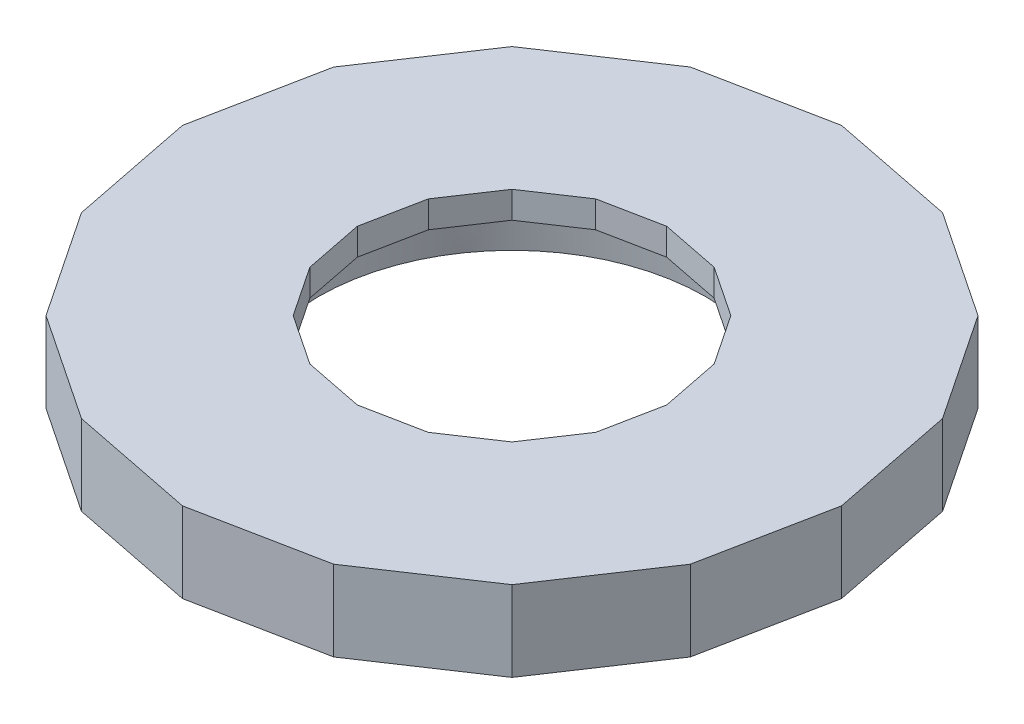
ISO-10303-21;
HEADER;
FILE_DESCRIPTION(('STEP AP214'),'2;1');
FILE_NAME('part.step','',(''),(''),'','','');
FILE_SCHEMA(('AUTOMOTIVE_DESIGN { 1 0 10303 214 1 1 1 1 }'));
ENDSEC;
DATA;
#1=APPLICATION_CONTEXT('core data for automotive mechanical design processes');
#2=APPLICATION_PROTOCOL_DEFINITION('international standard','automotive_design',2000,#1);
#3=PRODUCT_CONTEXT('',#1,'mechanical');
#4=PRODUCT('Part','Part','',(#3));
#5=PRODUCT_RELATED_PRODUCT_CATEGORY('part','',(#4));
#6=PRODUCT_DEFINITION_FORMATION('','',#4);
#7=PRODUCT_DEFINITION_CONTEXT('part definition',#1,'design');
#8=PRODUCT_DEFINITION('design','',#6,#7);
#9=PRODUCT_DEFINITION_SHAPE('','',#8);
#10=(LENGTH_UNIT() NAMED_UNIT(*) SI_UNIT(.MILLI.,.METRE.));
#11=(NAMED_UNIT(*) PLANE_ANGLE_UNIT() SI_UNIT($,.RADIAN.));
#12=(NAMED_UNIT(*) SI_UNIT($,.STERADIAN.) SOLID_ANGLE_UNIT());
#13=UNCERTAINTY_MEASURE_WITH_UNIT(LENGTH_MEASURE(1.E-05),#10,'distance_accuracy_value','');
#14=(GEOMETRIC_REPRESENTATION_CONTEXT(3) GLOBAL_UNCERTAINTY_ASSIGNED_CONTEXT((#13)) GLOBAL_UNIT_ASSIGNED_CONTEXT((#10,
#11,#12)) REPRESENTATION_CONTEXT('',''));
#15=CARTESIAN_POINT('',(0.,0.,0.));
#16=DIRECTION('',(0.,0.,1.));
#17=DIRECTION('',(1.,0.,0.));
#18=AXIS2_PLACEMENT_3D('',#15,#16,#17);
#19=CARTESIAN_POINT('',(0.,0.,0.));
#20=DIRECTION('',(0.,1.,0.));
#21=DIRECTION('',(0.,0.,1.));
#22=AXIS2_PLACEMENT_3D('',#19,#20,#21);
#23=PLANE('',#22);
#24=DIRECTION('',(-0.195090322016129,0.,0.98078528040323));
#25=VECTOR('',#24,1.);
#26=CARTESIAN_POINT('',(-72.1713098321094,0.,-29.8943353466905));
#27=LINE('',#26,#25);
#28=CARTESIAN_POINT('',(-72.1713098321094,0.,-29.8943353466905));
#29=VERTEX_POINT('',#28);
#30=CARTESIAN_POINT('',(-78.117662847161,0.,0.));
#31=VERTEX_POINT('',#30);
#32=EDGE_CURVE('E305',#29,#31,#27,.T.);
#33=ORIENTED_EDGE('',*,*,#32,.F.);
#34=DIRECTION('',(-0.555570233019603,0.,0.831469612302545));
#35=VECTOR('',#34,1.);
#36=CARTESIAN_POINT('',(-55.2375291296719,0.,-55.237529129672));
#37=LINE('',#36,#35);
#38=CARTESIAN_POINT('',(-55.2375291296719,0.,-55.237529129672));
#39=VERTEX_POINT('',#38);
#40=EDGE_CURVE('E310',#39,#29,#37,.T.);
#41=ORIENTED_EDGE('',*,*,#40,.F.);
#42=DIRECTION('',(-0.831469612302546,0.,0.555570233019601));
#43=VECTOR('',#42,1.);
#44=CARTESIAN_POINT('',(-29.8943353466904,0.,-72.1713098321094));
#45=LINE('',#44,#43);
#46=CARTESIAN_POINT('',(-29.8943353466904,0.,-72.1713098321094));
#47=VERTEX_POINT('',#46);
#48=EDGE_CURVE('E375',#47,#39,#45,.T.);
#49=ORIENTED_EDGE('',*,*,#48,.F.);
#50=DIRECTION('',(-0.980785280403231,0.,0.195090322016127));
#51=VECTOR('',#50,1.);
#52=CARTESIAN_POINT('',(0.,0.,-78.1176628471609));
#53=LINE('',#52,#51);
#54=CARTESIAN_POINT('',(0.,0.,-78.1176628471609));
#55=VERTEX_POINT('',#54);
#56=EDGE_CURVE('E373',#55,#47,#53,.T.);
#57=ORIENTED_EDGE('',*,*,#56,.F.);
#58=DIRECTION('',(-0.98078528040323,0.,-0.195090322016128));
#59=VECTOR('',#58,1.);
#60=CARTESIAN_POINT('',(29.8943353466906,0.,-72.1713098321093));
#61=LINE('',#60,#59);
#62=CARTESIAN_POINT('',(29.8943353466906,0.,-72.1713098321093));
#63=VERTEX_POINT('',#62);
#64=EDGE_CURVE('E371',#63,#55,#61,.T.);
#65=ORIENTED_EDGE('',*,*,#64,.F.);
#66=DIRECTION('',(-0.831469612302545,0.,-0.555570233019603));
#67=VECTOR('',#66,1.);
#68=CARTESIAN_POINT('',(55.237529129672,0.,-55.2375291296719));
#69=LINE('',#68,#67);
#70=CARTESIAN_POINT('',(55.237529129672,0.,-55.2375291296719));
#71=VERTEX_POINT('',#70);
#72=EDGE_CURVE('E369',#71,#63,#69,.T.);
#73=ORIENTED_EDGE('',*,*,#72,.F.);
#74=DIRECTION('',(-0.555570233019601,0.,-0.831469612302546));
#75=VECTOR('',#74,1.);
#76=CARTESIAN_POINT('',(72.1713098321094,0.,-29.8943353466904));
#77=LINE('',#76,#75);
#78=CARTESIAN_POINT('',(72.1713098321094,0.,-29.8943353466904));
#79=VERTEX_POINT('',#78);
#80=EDGE_CURVE('E367',#79,#71,#77,.T.);
#81=ORIENTED_EDGE('',*,*,#80,.F.);
#82=DIRECTION('',(-0.195090322016128,0.,-0.980785280403231));
#83=VECTOR('',#82,1.);
#84=CARTESIAN_POINT('',(78.117662847161,0.,0.));
#85=LINE('',#84,#83);
#86=CARTESIAN_POINT('',(78.117662847161,0.,0.));
#87=VERTEX_POINT('',#86);
#88=EDGE_CURVE('E365',#87,#79,#85,.T.);
#89=ORIENTED_EDGE('',*,*,#88,.F.);
#90=DIRECTION('',(0.195090322016129,0.,-0.98078528040323));
#91=VECTOR('',#90,1.);
#92=CARTESIAN_POINT('',(72.1713098321094,0.,29.8943353466904));
#93=LINE('',#92,#91);
#94=CARTESIAN_POINT('',(72.1713098321094,0.,29.8943353466904));
#95=VERTEX_POINT('',#94);
#96=EDGE_CURVE('E363',#95,#87,#93,.T.);
#97=ORIENTED_EDGE('',*,*,#96,.F.);
#98=DIRECTION('',(0.555570233019603,0.,-0.831469612302545));
#99=VECTOR('',#98,1.);
#100=CARTESIAN_POINT('',(55.2375291296719,0.,55.237529129672));
#101=LINE('',#100,#99);
#102=CARTESIAN_POINT('',(55.2375291296719,0.,55.237529129672));
#103=VERTEX_POINT('',#102);
#104=EDGE_CURVE('E361',#103,#95,#101,.T.);
#105=ORIENTED_EDGE('',*,*,#104,.F.);
#106=DIRECTION('',(0.831469612302546,0.,-0.555570233019601));
#107=VECTOR('',#106,1.);
#108=CARTESIAN_POINT('',(29.8943353466904,0.,72.1713098321094));
#109=LINE('',#108,#107);
#110=CARTESIAN_POINT('',(29.8943353466904,0.,72.1713098321094));
#111=VERTEX_POINT('',#110);
#112=EDGE_CURVE('E359',#111,#103,#109,.T.);
#113=ORIENTED_EDGE('',*,*,#112,.F.);
#114=DIRECTION('',(0.980785280403231,0.,-0.195090322016127));
#115=VECTOR('',#114,1.);
#116=CARTESIAN_POINT('',(0.,0.,78.117662847161));
#117=LINE('',#116,#115);
#118=CARTESIAN_POINT('',(0.,0.,78.117662847161));
#119=VERTEX_POINT('',#118);
#120=EDGE_CURVE('E356',#119,#111,#117,.T.);
#121=ORIENTED_EDGE('',*,*,#120,.F.);
#122=DIRECTION('',(0.98078528040323,0.,0.195090322016128));
#123=VECTOR('',#122,1.);
#124=CARTESIAN_POINT('',(-29.8943353466905,0.,72.1713098321094));
#125=LINE('',#124,#123);
#126=CARTESIAN_POINT('',(-29.8943353466905,0.,72.1713098321094));
#127=VERTEX_POINT('',#126);
#128=EDGE_CURVE('E354',#127,#119,#125,.T.);
#129=ORIENTED_EDGE('',*,*,#128,.F.);
#130=DIRECTION('',(0.831469612302545,0.,0.555570233019603));
#131=VECTOR('',#130,1.);
#132=CARTESIAN_POINT('',(-55.237529129672,0.,55.2375291296719));
#133=LINE('',#132,#131);
#134=CARTESIAN_POINT('',(-55.237529129672,0.,55.2375291296719));
#135=VERTEX_POINT('',#134);
#136=EDGE_CURVE('E352',#135,#127,#133,.T.);
#137=ORIENTED_EDGE('',*,*,#136,.F.);
#138=DIRECTION('',(0.555570233019601,0.,0.831469612302546));
#139=VECTOR('',#138,1.);
#140=CARTESIAN_POINT('',(-72.1713098321094,0.,29.8943353466904));
#141=LINE('',#140,#139);
#142=CARTESIAN_POINT('',(-72.1713098321094,0.,29.8943353466904));
#143=VERTEX_POINT('',#142);
#144=EDGE_CURVE('E350',#143,#135,#141,.T.);
#145=ORIENTED_EDGE('',*,*,#144,.F.);
#146=DIRECTION('',(0.195090322016127,0.,0.980785280403231));
#147=VECTOR('',#146,1.);
#148=CARTESIAN_POINT('',(-78.117662847161,0.,0.));
#149=LINE('',#148,#147);
#150=EDGE_CURVE('E347',#31,#143,#149,.T.);
#151=ORIENTED_EDGE('',*,*,#150,.F.);
#152=EDGE_LOOP('',(#33,#41,#49,#57,#65,#73,#81,#89,#97,#105,#113,#121,#129,#137,#145,#151));
#153=FACE_BOUND('',#152,.T.);
#154=CARTESIAN_POINT('',(0.,0.,0.));
#155=DIRECTION('',(0.,-1.,0.));
#156=DIRECTION('',(1.,0.,0.));
#157=AXIS2_PLACEMENT_3D('',#154,#155,#156);
#158=CIRCLE('',#157,45.8942882882378);
#159=CARTESIAN_POINT('',(45.8942882882378,-1.33734634006263E-13,0.));
#160=VERTEX_POINT('',#159);
#161=EDGE_CURVE('E764',#160,#160,#158,.T.);
#162=ORIENTED_EDGE('',*,*,#161,.F.);
#163=EDGE_LOOP('',(#162));
#164=FACE_BOUND('',#163,.T.);
#165=ADVANCED_FACE('F34',(#153,#164),#23,.F.);
#166=CARTESIAN_POINT('',(-33.8892669105209,19.05,-14.0373939732195));
#167=DIRECTION('',(0.98078528040323,0.,0.195090322016129));
#168=DIRECTION('',(0.195090322016129,0.,-0.98078528040323));
#169=AXIS2_PLACEMENT_3D('',#166,#167,#168);
#170=PLANE('',#169);
#171=DIRECTION('',(0.,-1.,0.));
#172=VECTOR('',#171,1.);
#173=CARTESIAN_POINT('',(-36.6814781775749,19.05,0.));
#174=LINE('',#173,#172);
#175=CARTESIAN_POINT('',(-36.6814781775749,19.05,0.));
#176=VERTEX_POINT('',#175);
#177=CARTESIAN_POINT('',(-36.6814781775749,12.7,0.));
#178=VERTEX_POINT('',#177);
#179=EDGE_CURVE('E252',#176,#178,#174,.T.);
#180=ORIENTED_EDGE('',*,*,#179,.T.);
#181=DIRECTION('',(0.195090322016129,0.,-0.98078528040323));
#182=VECTOR('',#181,1.);
#183=CARTESIAN_POINT('',(-33.8892669105209,12.7,-14.0373939732195));
#184=LINE('',#183,#182);
#185=CARTESIAN_POINT('',(-33.8892669105209,12.7,-14.0373939732195));
#186=VERTEX_POINT('',#185);
#187=EDGE_CURVE('E242',#178,#186,#184,.T.);
#188=ORIENTED_EDGE('',*,*,#187,.T.);
#189=DIRECTION('',(0.,-1.,0.));
#190=VECTOR('',#189,1.);
#191=CARTESIAN_POINT('',(-33.8892669105209,19.05,-14.0373939732195));
#192=LINE('',#191,#190);
#193=CARTESIAN_POINT('',(-33.8892669105209,19.05,-14.0373939732195));
#194=VERTEX_POINT('',#193);
#195=EDGE_CURVE('E249',#194,#186,#192,.T.);
#196=ORIENTED_EDGE('',*,*,#195,.F.);
#197=DIRECTION('',(-0.195090322016129,0.,0.98078528040323));
#198=VECTOR('',#197,1.);
#199=CARTESIAN_POINT('',(-33.8892669105209,19.05,-14.0373939732195));
#200=LINE('',#199,#198);
#201=EDGE_CURVE('E253',#194,#176,#200,.T.);
#202=ORIENTED_EDGE('',*,*,#201,.T.);
#203=EDGE_LOOP('',(#180,#188,#196,#202));
#204=FACE_BOUND('',#203,.T.);
#205=ADVANCED_FACE('F248',(#204),#170,.T.);
#206=CARTESIAN_POINT('',(-36.6814781775749,19.05,0.));
#207=DIRECTION('',(0.98078528040323,0.,-0.195090322016128));
#208=DIRECTION('',(-0.195090322016128,0.,-0.980785280403231));
#209=AXIS2_PLACEMENT_3D('',#206,#207,#208);
#210=PLANE('',#209);
#211=DIRECTION('',(0.,-1.,0.));
#212=VECTOR('',#211,1.);
#213=CARTESIAN_POINT('',(-33.8892669105209,19.05,14.0373939732195));
#214=LINE('',#213,#212);
#215=CARTESIAN_POINT('',(-33.8892669105209,19.05,14.0373939732195));
#216=VERTEX_POINT('',#215);
#217=CARTESIAN_POINT('',(-33.8892669105209,12.7,14.0373939732195));
#218=VERTEX_POINT('',#217);
#219=EDGE_CURVE('E301',#216,#218,#214,.T.);
#220=ORIENTED_EDGE('',*,*,#219,.T.);
#221=DIRECTION('',(-0.195090322016128,0.,-0.980785280403231));
#222=VECTOR('',#221,1.);
#223=CARTESIAN_POINT('',(-36.6814781775749,12.7,0.));
#224=LINE('',#223,#222);
#225=EDGE_CURVE('E254',#218,#178,#224,.T.);
#226=ORIENTED_EDGE('',*,*,#225,.T.);
#227=ORIENTED_EDGE('',*,*,#179,.F.);
#228=DIRECTION('',(0.195090322016128,0.,0.980785280403231));
#229=VECTOR('',#228,1.);
#230=CARTESIAN_POINT('',(-36.6814781775749,19.05,0.));
#231=LINE('',#230,#229);
#232=EDGE_CURVE('E810',#176,#216,#231,.T.);
#233=ORIENTED_EDGE('',*,*,#232,.T.);
#234=EDGE_LOOP('',(#220,#226,#227,#233));
#235=FACE_BOUND('',#234,.T.);
#236=ADVANCED_FACE('F520',(#235),#210,.T.);
#237=CARTESIAN_POINT('',(-33.8892669105209,19.05,14.0373939732195));
#238=DIRECTION('',(0.831469612302545,0.,-0.555570233019602));
#239=DIRECTION('',(-0.555570233019602,0.,-0.831469612302546));
#240=AXIS2_PLACEMENT_3D('',#237,#238,#239);
#241=PLANE('',#240);
#242=DIRECTION('',(0.,-1.,0.));
#243=VECTOR('',#242,1.);
#244=CARTESIAN_POINT('',(-25.9377219633096,19.05,25.9377219633095));
#245=LINE('',#244,#243);
#246=CARTESIAN_POINT('',(-25.9377219633096,19.05,25.9377219633095));
#247=VERTEX_POINT('',#246);
#248=CARTESIAN_POINT('',(-25.9377219633096,12.7,25.9377219633095));
#249=VERTEX_POINT('',#248);
#250=EDGE_CURVE('E298',#247,#249,#245,.T.);
#251=ORIENTED_EDGE('',*,*,#250,.T.);
#252=DIRECTION('',(-0.555570233019602,0.,-0.831469612302546));
#253=VECTOR('',#252,1.);
#254=CARTESIAN_POINT('',(-33.8892669105209,12.7,14.0373939732195));
#255=LINE('',#254,#253);
#256=EDGE_CURVE('E805',#249,#218,#255,.T.);
#257=ORIENTED_EDGE('',*,*,#256,.T.);
#258=ORIENTED_EDGE('',*,*,#219,.F.);
#259=DIRECTION('',(0.555570233019602,0.,0.831469612302545));
#260=VECTOR('',#259,1.);
#261=CARTESIAN_POINT('',(-33.8892669105209,19.05,14.0373939732195));
#262=LINE('',#261,#260);
#263=EDGE_CURVE('E812',#216,#247,#262,.T.);
#264=ORIENTED_EDGE('',*,*,#263,.T.);
#265=EDGE_LOOP('',(#251,#257,#258,#264));
#266=FACE_BOUND('',#265,.T.);
#267=ADVANCED_FACE('F696',(#266),#241,.T.);
#268=CARTESIAN_POINT('',(-25.9377219633096,19.05,25.9377219633095));
#269=DIRECTION('',(0.555570233019603,0.,-0.831469612302545));
#270=DIRECTION('',(-0.831469612302545,0.,-0.555570233019603));
#271=AXIS2_PLACEMENT_3D('',#268,#269,#270);
#272=PLANE('',#271);
#273=DIRECTION('',(0.,-1.,0.));
#274=VECTOR('',#273,1.);
#275=CARTESIAN_POINT('',(-14.0373939732195,19.05,33.8892669105208));
#276=LINE('',#275,#274);
#277=CARTESIAN_POINT('',(-14.0373939732195,19.05,33.8892669105208));
#278=VERTEX_POINT('',#277);
#279=CARTESIAN_POINT('',(-14.0373939732195,12.7,33.8892669105208));
#280=VERTEX_POINT('',#279);
#281=EDGE_CURVE('E295',#278,#280,#276,.T.);
#282=ORIENTED_EDGE('',*,*,#281,.T.);
#283=DIRECTION('',(-0.831469612302545,0.,-0.555570233019603));
#284=VECTOR('',#283,1.);
#285=CARTESIAN_POINT('',(-25.9377219633096,12.7,25.9377219633095));
#286=LINE('',#285,#284);
#287=EDGE_CURVE('E802',#280,#249,#286,.T.);
#288=ORIENTED_EDGE('',*,*,#287,.T.);
#289=ORIENTED_EDGE('',*,*,#250,.F.);
#290=DIRECTION('',(0.831469612302545,0.,0.555570233019603));
#291=VECTOR('',#290,1.);
#292=CARTESIAN_POINT('',(-25.9377219633096,19.05,25.9377219633095));
#293=LINE('',#292,#291);
#294=EDGE_CURVE('E814',#247,#278,#293,.T.);
#295=ORIENTED_EDGE('',*,*,#294,.T.);
#296=EDGE_LOOP('',(#282,#288,#289,#295));
#297=FACE_BOUND('',#296,.T.);
#298=ADVANCED_FACE('F687',(#297),#272,.T.);
#299=CARTESIAN_POINT('',(-14.0373939732195,19.05,33.8892669105208));
#300=DIRECTION('',(0.195090322016128,0.,-0.980785280403231));
#301=DIRECTION('',(-0.98078528040323,0.,-0.195090322016128));
#302=AXIS2_PLACEMENT_3D('',#299,#300,#301);
#303=PLANE('',#302);
#304=DIRECTION('',(0.,-1.,0.));
#305=VECTOR('',#304,1.);
#306=CARTESIAN_POINT('',(0.,19.05,36.6814781775749));
#307=LINE('',#306,#305);
#308=CARTESIAN_POINT('',(0.,19.05,36.6814781775749));
#309=VERTEX_POINT('',#308);
#310=CARTESIAN_POINT('',(0.,12.7,36.6814781775749));
#311=VERTEX_POINT('',#310);
#312=EDGE_CURVE('E292',#309,#311,#307,.T.);
#313=ORIENTED_EDGE('',*,*,#312,.T.);
#314=DIRECTION('',(-0.98078528040323,0.,-0.195090322016128));
#315=VECTOR('',#314,1.);
#316=CARTESIAN_POINT('',(-14.0373939732195,12.7,33.8892669105208));
#317=LINE('',#316,#315);
#318=EDGE_CURVE('E799',#311,#280,#317,.T.);
#319=ORIENTED_EDGE('',*,*,#318,.T.);
#320=ORIENTED_EDGE('',*,*,#281,.F.);
#321=DIRECTION('',(0.98078528040323,0.,0.195090322016128));
#322=VECTOR('',#321,1.);
#323=CARTESIAN_POINT('',(-14.0373939732195,19.05,33.8892669105208));
#324=LINE('',#323,#322);
#325=EDGE_CURVE('E816',#278,#309,#324,.T.);
#326=ORIENTED_EDGE('',*,*,#325,.T.);
#327=EDGE_LOOP('',(#313,#319,#320,#326));
#328=FACE_BOUND('',#327,.T.);
#329=ADVANCED_FACE('F678',(#328),#303,.T.);
#330=CARTESIAN_POINT('',(0.,19.05,36.6814781775749));
#331=DIRECTION('',(-0.195090322016128,0.,-0.980785280403231));
#332=DIRECTION('',(-0.980785280403231,0.,0.195090322016128));
#333=AXIS2_PLACEMENT_3D('',#330,#331,#332);
#334=PLANE('',#333);
#335=DIRECTION('',(0.,-1.,0.));
#336=VECTOR('',#335,1.);
#337=CARTESIAN_POINT('',(14.0373939732195,19.05,33.8892669105209));
#338=LINE('',#337,#336);
#339=CARTESIAN_POINT('',(14.0373939732195,19.05,33.8892669105209));
#340=VERTEX_POINT('',#339);
#341=CARTESIAN_POINT('',(14.0373939732195,12.6999999999999,33.8892669105209));
#342=VERTEX_POINT('',#341);
#343=EDGE_CURVE('E289',#340,#342,#338,.T.);
#344=ORIENTED_EDGE('',*,*,#343,.T.);
#345=DIRECTION('',(-0.980785280403231,0.,0.195090322016128));
#346=VECTOR('',#345,1.);
#347=CARTESIAN_POINT('',(0.,12.7,36.6814781775749));
#348=LINE('',#347,#346);
#349=EDGE_CURVE('E796',#342,#311,#348,.T.);
#350=ORIENTED_EDGE('',*,*,#349,.T.);
#351=ORIENTED_EDGE('',*,*,#312,.F.);
#352=DIRECTION('',(0.980785280403231,0.,-0.195090322016128));
#353=VECTOR('',#352,1.);
#354=CARTESIAN_POINT('',(0.,19.05,36.6814781775749));
#355=LINE('',#354,#353);
#356=EDGE_CURVE('E819',#309,#340,#355,.T.);
#357=ORIENTED_EDGE('',*,*,#356,.T.);
#358=EDGE_LOOP('',(#344,#350,#351,#357));
#359=FACE_BOUND('',#358,.T.);
#360=ADVANCED_FACE('F669',(#359),#334,.T.);
#361=CARTESIAN_POINT('',(14.0373939732195,19.05,33.8892669105209));
#362=DIRECTION('',(-0.555570233019602,0.,-0.831469612302545));
#363=DIRECTION('',(-0.831469612302545,0.,0.555570233019602));
#364=AXIS2_PLACEMENT_3D('',#361,#362,#363);
#365=PLANE('',#364);
#366=DIRECTION('',(0.,-1.,0.));
#367=VECTOR('',#366,1.);
#368=CARTESIAN_POINT('',(25.9377219633096,19.05,25.9377219633096));
#369=LINE('',#368,#367);
#370=CARTESIAN_POINT('',(25.9377219633096,19.05,25.9377219633096));
#371=VERTEX_POINT('',#370);
#372=CARTESIAN_POINT('',(25.9377219633095,12.6999999999999,25.9377219633096));
#373=VERTEX_POINT('',#372);
#374=EDGE_CURVE('E286',#371,#373,#369,.T.);
#375=ORIENTED_EDGE('',*,*,#374,.T.);
#376=DIRECTION('',(-0.831469612302545,0.,0.555570233019602));
#377=VECTOR('',#376,1.);
#378=CARTESIAN_POINT('',(14.0373939732195,12.6999999999999,33.8892669105209));
#379=LINE('',#378,#377);
#380=EDGE_CURVE('E793',#373,#342,#379,.T.);
#381=ORIENTED_EDGE('',*,*,#380,.T.);
#382=ORIENTED_EDGE('',*,*,#343,.F.);
#383=DIRECTION('',(0.831469612302545,0.,-0.555570233019602));
#384=VECTOR('',#383,1.);
#385=CARTESIAN_POINT('',(14.0373939732195,19.05,33.8892669105209));
#386=LINE('',#385,#384);
#387=EDGE_CURVE('E821',#340,#371,#386,.T.);
#388=ORIENTED_EDGE('',*,*,#387,.T.);
#389=EDGE_LOOP('',(#375,#381,#382,#388));
#390=FACE_BOUND('',#389,.T.);
#391=ADVANCED_FACE('F660',(#390),#365,.T.);
#392=CARTESIAN_POINT('',(25.9377219633096,19.05,25.9377219633096));
#393=DIRECTION('',(-0.831469612302545,0.,-0.555570233019603));
#394=DIRECTION('',(-0.555570233019603,0.,0.831469612302545));
#395=AXIS2_PLACEMENT_3D('',#392,#393,#394);
#396=PLANE('',#395);
#397=DIRECTION('',(0.,-1.,0.));
#398=VECTOR('',#397,1.);
#399=CARTESIAN_POINT('',(33.8892669105209,19.05,14.0373939732195));
#400=LINE('',#399,#398);
#401=CARTESIAN_POINT('',(33.8892669105209,19.05,14.0373939732195));
#402=VERTEX_POINT('',#401);
#403=CARTESIAN_POINT('',(33.8892669105209,12.6999999999999,14.0373939732195));
#404=VERTEX_POINT('',#403);
#405=EDGE_CURVE('E283',#402,#404,#400,.T.);
#406=ORIENTED_EDGE('',*,*,#405,.T.);
#407=DIRECTION('',(-0.555570233019603,0.,0.831469612302545));
#408=VECTOR('',#407,1.);
#409=CARTESIAN_POINT('',(25.9377219633095,12.6999999999999,25.9377219633096));
#410=LINE('',#409,#408);
#411=EDGE_CURVE('E790',#404,#373,#410,.T.);
#412=ORIENTED_EDGE('',*,*,#411,.T.);
#413=ORIENTED_EDGE('',*,*,#374,.F.);
#414=DIRECTION('',(0.555570233019603,0.,-0.831469612302545));
#415=VECTOR('',#414,1.);
#416=CARTESIAN_POINT('',(25.9377219633096,19.05,25.9377219633096));
#417=LINE('',#416,#415);
#418=EDGE_CURVE('E823',#371,#402,#417,.T.);
#419=ORIENTED_EDGE('',*,*,#418,.T.);
#420=EDGE_LOOP('',(#406,#412,#413,#419));
#421=FACE_BOUND('',#420,.T.);
#422=ADVANCED_FACE('F651',(#421),#396,.T.);
#423=CARTESIAN_POINT('',(33.8892669105209,19.05,14.0373939732195));
#424=DIRECTION('',(-0.98078528040323,0.,-0.195090322016128));
#425=DIRECTION('',(-0.195090322016128,0.,0.98078528040323));
#426=AXIS2_PLACEMENT_3D('',#423,#424,#425);
#427=PLANE('',#426);
#428=DIRECTION('',(0.,-1.,0.));
#429=VECTOR('',#428,1.);
#430=CARTESIAN_POINT('',(36.6814781775749,19.05,0.));
#431=LINE('',#430,#429);
#432=CARTESIAN_POINT('',(36.6814781775749,19.05,0.));
#433=VERTEX_POINT('',#432);
#434=CARTESIAN_POINT('',(36.6814781775749,12.6999999999999,0.));
#435=VERTEX_POINT('',#434);
#436=EDGE_CURVE('E280',#433,#435,#431,.T.);
#437=ORIENTED_EDGE('',*,*,#436,.T.);
#438=DIRECTION('',(-0.195090322016128,0.,0.98078528040323));
#439=VECTOR('',#438,1.);
#440=CARTESIAN_POINT('',(33.8892669105209,12.6999999999999,14.0373939732195));
#441=LINE('',#440,#439);
#442=EDGE_CURVE('E787',#435,#404,#441,.T.);
#443=ORIENTED_EDGE('',*,*,#442,.T.);
#444=ORIENTED_EDGE('',*,*,#405,.F.);
#445=DIRECTION('',(0.195090322016128,0.,-0.98078528040323));
#446=VECTOR('',#445,1.);
#447=CARTESIAN_POINT('',(33.8892669105209,19.05,14.0373939732195));
#448=LINE('',#447,#446);
#449=EDGE_CURVE('E825',#402,#433,#448,.T.);
#450=ORIENTED_EDGE('',*,*,#449,.T.);
#451=EDGE_LOOP('',(#437,#443,#444,#450));
#452=FACE_BOUND('',#451,.T.);
#453=ADVANCED_FACE('F642',(#452),#427,.T.);
#454=CARTESIAN_POINT('',(36.6814781775749,19.05,0.));
#455=DIRECTION('',(-0.98078528040323,0.,0.195090322016128));
#456=DIRECTION('',(0.195090322016128,0.,0.980785280403231));
#457=AXIS2_PLACEMENT_3D('',#454,#455,#456);
#458=PLANE('',#457);
#459=DIRECTION('',(0.,-1.,0.));
#460=VECTOR('',#459,1.);
#461=CARTESIAN_POINT('',(33.8892669105209,19.05,-14.0373939732195));
#462=LINE('',#461,#460);
#463=CARTESIAN_POINT('',(33.8892669105209,19.05,-14.0373939732195));
#464=VERTEX_POINT('',#463);
#465=CARTESIAN_POINT('',(33.8892669105209,12.6999999999999,-14.0373939732195));
#466=VERTEX_POINT('',#465);
#467=EDGE_CURVE('E277',#464,#466,#462,.T.);
#468=ORIENTED_EDGE('',*,*,#467,.T.);
#469=DIRECTION('',(0.195090322016128,0.,0.980785280403231));
#470=VECTOR('',#469,1.);
#471=CARTESIAN_POINT('',(36.6814781775749,12.6999999999999,0.));
#472=LINE('',#471,#470);
#473=EDGE_CURVE('E784',#466,#435,#472,.T.);
#474=ORIENTED_EDGE('',*,*,#473,.T.);
#475=ORIENTED_EDGE('',*,*,#436,.F.);
#476=DIRECTION('',(-0.195090322016128,0.,-0.980785280403231));
#477=VECTOR('',#476,1.);
#478=CARTESIAN_POINT('',(36.6814781775749,19.05,0.));
#479=LINE('',#478,#477);
#480=EDGE_CURVE('E827',#433,#464,#479,.T.);
#481=ORIENTED_EDGE('',*,*,#480,.T.);
#482=EDGE_LOOP('',(#468,#474,#475,#481));
#483=FACE_BOUND('',#482,.T.);
#484=ADVANCED_FACE('F633',(#483),#458,.T.);
#485=CARTESIAN_POINT('',(33.8892669105209,19.05,-14.0373939732195));
#486=DIRECTION('',(-0.831469612302545,0.,0.555570233019602));
#487=DIRECTION('',(0.555570233019602,0.,0.831469612302545));
#488=AXIS2_PLACEMENT_3D('',#485,#486,#487);
#489=PLANE('',#488);
#490=DIRECTION('',(0.,-1.,0.));
#491=VECTOR('',#490,1.);
#492=CARTESIAN_POINT('',(25.9377219633096,19.05,-25.9377219633096));
#493=LINE('',#492,#491);
#494=CARTESIAN_POINT('',(25.9377219633096,19.05,-25.9377219633096));
#495=VERTEX_POINT('',#494);
#496=CARTESIAN_POINT('',(25.9377219633096,12.6999999999999,-25.9377219633095));
#497=VERTEX_POINT('',#496);
#498=EDGE_CURVE('E274',#495,#497,#493,.T.);
#499=ORIENTED_EDGE('',*,*,#498,.T.);
#500=DIRECTION('',(0.555570233019602,0.,0.831469612302545));
#501=VECTOR('',#500,1.);
#502=CARTESIAN_POINT('',(33.8892669105209,12.6999999999999,-14.0373939732195));
#503=LINE('',#502,#501);
#504=EDGE_CURVE('E781',#497,#466,#503,.T.);
#505=ORIENTED_EDGE('',*,*,#504,.T.);
#506=ORIENTED_EDGE('',*,*,#467,.F.);
#507=DIRECTION('',(-0.555570233019602,0.,-0.831469612302545));
#508=VECTOR('',#507,1.);
#509=CARTESIAN_POINT('',(33.8892669105209,19.05,-14.0373939732195));
#510=LINE('',#509,#508);
#511=EDGE_CURVE('E829',#464,#495,#510,.T.);
#512=ORIENTED_EDGE('',*,*,#511,.T.);
#513=EDGE_LOOP('',(#499,#505,#506,#512));
#514=FACE_BOUND('',#513,.T.);
#515=ADVANCED_FACE('F624',(#514),#489,.T.);
#516=CARTESIAN_POINT('',(25.9377219633096,19.05,-25.9377219633096));
#517=DIRECTION('',(-0.555570233019603,0.,0.831469612302545));
#518=DIRECTION('',(0.831469612302545,0.,0.555570233019603));
#519=AXIS2_PLACEMENT_3D('',#516,#517,#518);
#520=PLANE('',#519);
#521=DIRECTION('',(0.,-1.,0.));
#522=VECTOR('',#521,1.);
#523=CARTESIAN_POINT('',(14.0373939732195,19.05,-33.8892669105208));
#524=LINE('',#523,#522);
#525=CARTESIAN_POINT('',(14.0373939732195,19.05,-33.8892669105208));
#526=VERTEX_POINT('',#525);
#527=CARTESIAN_POINT('',(14.0373939732195,12.6999999999999,-33.8892669105208));
#528=VERTEX_POINT('',#527);
#529=EDGE_CURVE('E271',#526,#528,#524,.T.);
#530=ORIENTED_EDGE('',*,*,#529,.T.);
#531=DIRECTION('',(0.831469612302545,0.,0.555570233019603));
#532=VECTOR('',#531,1.);
#533=CARTESIAN_POINT('',(25.9377219633096,12.6999999999999,-25.9377219633096));
#534=LINE('',#533,#532);
#535=EDGE_CURVE('E778',#528,#497,#534,.T.);
#536=ORIENTED_EDGE('',*,*,#535,.T.);
#537=ORIENTED_EDGE('',*,*,#498,.F.);
#538=DIRECTION('',(-0.831469612302545,0.,-0.555570233019602));
#539=VECTOR('',#538,1.);
#540=CARTESIAN_POINT('',(25.9377219633096,19.05,-25.9377219633096));
#541=LINE('',#540,#539);
#542=EDGE_CURVE('E831',#495,#526,#541,.T.);
#543=ORIENTED_EDGE('',*,*,#542,.T.);
#544=EDGE_LOOP('',(#530,#536,#537,#543));
#545=FACE_BOUND('',#544,.T.);
#546=ADVANCED_FACE('F615',(#545),#520,.T.);
#547=CARTESIAN_POINT('',(14.0373939732195,19.05,-33.8892669105208));
#548=DIRECTION('',(-0.195090322016129,0.,0.98078528040323));
#549=DIRECTION('',(0.980785280403231,0.,0.195090322016129));
#550=AXIS2_PLACEMENT_3D('',#547,#548,#549);
#551=PLANE('',#550);
#552=DIRECTION('',(0.,-1.,0.));
#553=VECTOR('',#552,1.);
#554=CARTESIAN_POINT('',(0.,19.05,-36.6814781775749));
#555=LINE('',#554,#553);
#556=CARTESIAN_POINT('',(0.,19.05,-36.6814781775749));
#557=VERTEX_POINT('',#556);
#558=CARTESIAN_POINT('',(0.,12.7,-36.6814781775749));
#559=VERTEX_POINT('',#558);
#560=EDGE_CURVE('E268',#557,#559,#555,.T.);
#561=ORIENTED_EDGE('',*,*,#560,.T.);
#562=DIRECTION('',(0.980785280403231,0.,0.195090322016129));
#563=VECTOR('',#562,1.);
#564=CARTESIAN_POINT('',(14.0373939732195,12.6999999999999,-33.8892669105208));
#565=LINE('',#564,#563);
#566=EDGE_CURVE('E775',#559,#528,#565,.T.);
#567=ORIENTED_EDGE('',*,*,#566,.T.);
#568=ORIENTED_EDGE('',*,*,#529,.F.);
#569=DIRECTION('',(-0.98078528040323,0.,-0.195090322016129));
#570=VECTOR('',#569,1.);
#571=CARTESIAN_POINT('',(14.0373939732195,19.05,-33.8892669105208));
#572=LINE('',#571,#570);
#573=EDGE_CURVE('E833',#526,#557,#572,.T.);
#574=ORIENTED_EDGE('',*,*,#573,.T.);
#575=EDGE_LOOP('',(#561,#567,#568,#574));
#576=FACE_BOUND('',#575,.T.);
#577=ADVANCED_FACE('F606',(#576),#551,.T.);
#578=CARTESIAN_POINT('',(0.,19.05,-36.6814781775749));
#579=DIRECTION('',(0.195090322016128,0.,0.980785280403231));
#580=DIRECTION('',(0.980785280403231,0.,-0.195090322016128));
#581=AXIS2_PLACEMENT_3D('',#578,#579,#580);
#582=PLANE('',#581);
#583=DIRECTION('',(0.,-1.,0.));
#584=VECTOR('',#583,1.);
#585=CARTESIAN_POINT('',(-14.0373939732195,19.05,-33.8892669105209));
#586=LINE('',#585,#584);
#587=CARTESIAN_POINT('',(-14.0373939732195,19.05,-33.8892669105209));
#588=VERTEX_POINT('',#587);
#589=CARTESIAN_POINT('',(-14.0373939732195,12.7,-33.8892669105209));
#590=VERTEX_POINT('',#589);
#591=EDGE_CURVE('E260',#588,#590,#586,.T.);
#592=ORIENTED_EDGE('',*,*,#591,.T.);
#593=DIRECTION('',(0.980785280403231,0.,-0.195090322016128));
#594=VECTOR('',#593,1.);
#595=CARTESIAN_POINT('',(0.,12.7,-36.6814781775749));
#596=LINE('',#595,#594);
#597=EDGE_CURVE('E769',#590,#559,#596,.T.);
#598=ORIENTED_EDGE('',*,*,#597,.T.);
#599=ORIENTED_EDGE('',*,*,#560,.F.);
#600=DIRECTION('',(-0.980785280403231,0.,0.195090322016128));
#601=VECTOR('',#600,1.);
#602=CARTESIAN_POINT('',(0.,19.05,-36.6814781775749));
#603=LINE('',#602,#601);
#604=EDGE_CURVE('E835',#557,#588,#603,.T.);
#605=ORIENTED_EDGE('',*,*,#604,.T.);
#606=EDGE_LOOP('',(#592,#598,#599,#605));
#607=FACE_BOUND('',#606,.T.);
#608=ADVANCED_FACE('F597',(#607),#582,.T.);
#609=CARTESIAN_POINT('',(-14.0373939732195,19.05,-33.8892669105209));
#610=DIRECTION('',(0.555570233019602,0.,0.831469612302545));
#611=DIRECTION('',(0.831469612302546,0.,-0.555570233019602));
#612=AXIS2_PLACEMENT_3D('',#609,#610,#611);
#613=PLANE('',#612);
#614=DIRECTION('',(0.,-1.,0.));
#615=VECTOR('',#614,1.);
#616=CARTESIAN_POINT('',(-25.9377219633096,19.05,-25.9377219633096));
#617=LINE('',#616,#615);
#618=CARTESIAN_POINT('',(-25.9377219633096,19.05,-25.9377219633096));
#619=VERTEX_POINT('',#618);
#620=CARTESIAN_POINT('',(-25.9377219633096,12.7,-25.9377219633096));
#621=VERTEX_POINT('',#620);
#622=EDGE_CURVE('E55',#619,#621,#617,.T.);
#623=ORIENTED_EDGE('',*,*,#622,.T.);
#624=DIRECTION('',(0.831469612302546,0.,-0.555570233019602));
#625=VECTOR('',#624,1.);
#626=CARTESIAN_POINT('',(-14.0373939732195,12.7,-33.8892669105209));
#627=LINE('',#626,#625);
#628=EDGE_CURVE('E49',#621,#590,#627,.T.);
#629=ORIENTED_EDGE('',*,*,#628,.T.);
#630=ORIENTED_EDGE('',*,*,#591,.F.);
#631=DIRECTION('',(-0.831469612302545,0.,0.555570233019602));
#632=VECTOR('',#631,1.);
#633=CARTESIAN_POINT('',(-14.0373939732195,19.05,-33.8892669105209));
#634=LINE('',#633,#632);
#635=EDGE_CURVE('E262',#588,#619,#634,.T.);
#636=ORIENTED_EDGE('',*,*,#635,.T.);
#637=EDGE_LOOP('',(#623,#629,#630,#636));
#638=FACE_BOUND('',#637,.T.);
#639=ADVANCED_FACE('F589',(#638),#613,.T.);
#640=CARTESIAN_POINT('',(-25.9377219633096,19.05,-25.9377219633096));
#641=DIRECTION('',(0.831469612302545,0.,0.555570233019602));
#642=DIRECTION('',(0.555570233019602,0.,-0.831469612302545));
#643=AXIS2_PLACEMENT_3D('',#640,#641,#642);
#644=PLANE('',#643);
#645=ORIENTED_EDGE('',*,*,#195,.T.);
#646=DIRECTION('',(0.555570233019602,0.,-0.831469612302545));
#647=VECTOR('',#646,1.);
#648=CARTESIAN_POINT('',(-25.9377219633096,12.7,-25.9377219633096));
#649=LINE('',#648,#647);
#650=EDGE_CURVE('E11',#186,#621,#649,.T.);
#651=ORIENTED_EDGE('',*,*,#650,.T.);
#652=ORIENTED_EDGE('',*,*,#622,.F.);
#653=DIRECTION('',(-0.555570233019602,0.,0.831469612302545));
#654=VECTOR('',#653,1.);
#655=CARTESIAN_POINT('',(-25.9377219633096,19.05,-25.9377219633096));
#656=LINE('',#655,#654);
#657=EDGE_CURVE('E258',#619,#194,#656,.T.);
#658=ORIENTED_EDGE('',*,*,#657,.T.);
#659=EDGE_LOOP('',(#645,#651,#652,#658));
#660=FACE_BOUND('',#659,.T.);
#661=ADVANCED_FACE('F256',(#660),#644,.T.);
#662=CARTESIAN_POINT('',(0.,19.05,0.));
#663=DIRECTION('',(0.,1.,0.));
#664=DIRECTION('',(0.,0.,1.));
#665=AXIS2_PLACEMENT_3D('',#662,#663,#664);
#666=PLANE('',#665);
#667=DIRECTION('',(-0.195090322016129,0.,0.98078528040323));
#668=VECTOR('',#667,1.);
#669=CARTESIAN_POINT('',(-72.1713098321094,19.05,-29.8943353466905));
#670=LINE('',#669,#668);
#671=CARTESIAN_POINT('',(-72.1713098321094,19.05,-29.8943353466905));
#672=VERTEX_POINT('',#671);
#673=CARTESIAN_POINT('',(-78.117662847161,19.05,0.));
#674=VERTEX_POINT('',#673);
#675=EDGE_CURVE('E306',#672,#674,#670,.T.);
#676=ORIENTED_EDGE('',*,*,#675,.T.);
#677=DIRECTION('',(0.195090322016127,0.,0.980785280403231));
#678=VECTOR('',#677,1.);
#679=CARTESIAN_POINT('',(-78.117662847161,19.05,0.));
#680=LINE('',#679,#678);
#681=CARTESIAN_POINT('',(-72.1713098321094,19.05,29.8943353466904));
#682=VERTEX_POINT('',#681);
#683=EDGE_CURVE('E309',#674,#682,#680,.T.);
#684=ORIENTED_EDGE('',*,*,#683,.T.);
#685=DIRECTION('',(0.555570233019601,0.,0.831469612302546));
#686=VECTOR('',#685,1.);
#687=CARTESIAN_POINT('',(-72.1713098321094,19.05,29.8943353466904));
#688=LINE('',#687,#686);
#689=CARTESIAN_POINT('',(-55.237529129672,19.05,55.2375291296719));
#690=VERTEX_POINT('',#689);
#691=EDGE_CURVE('E313',#682,#690,#688,.T.);
#692=ORIENTED_EDGE('',*,*,#691,.T.);
#693=DIRECTION('',(0.831469612302545,0.,0.555570233019603));
#694=VECTOR('',#693,1.);
#695=CARTESIAN_POINT('',(-55.237529129672,19.05,55.2375291296719));
#696=LINE('',#695,#694);
#697=CARTESIAN_POINT('',(-29.8943353466905,19.05,72.1713098321094));
#698=VERTEX_POINT('',#697);
#699=EDGE_CURVE('E315',#690,#698,#696,.T.);
#700=ORIENTED_EDGE('',*,*,#699,.T.);
#701=DIRECTION('',(0.98078528040323,0.,0.195090322016128));
#702=VECTOR('',#701,1.);
#703=CARTESIAN_POINT('',(-29.8943353466905,19.05,72.1713098321094));
#704=LINE('',#703,#702);
#705=CARTESIAN_POINT('',(0.,19.05,78.117662847161));
#706=VERTEX_POINT('',#705);
#707=EDGE_CURVE('E318',#698,#706,#704,.T.);
#708=ORIENTED_EDGE('',*,*,#707,.T.);
#709=DIRECTION('',(0.980785280403231,0.,-0.195090322016127));
#710=VECTOR('',#709,1.);
#711=CARTESIAN_POINT('',(0.,19.05,78.117662847161));
#712=LINE('',#711,#710);
#713=CARTESIAN_POINT('',(29.8943353466904,19.05,72.1713098321094));
#714=VERTEX_POINT('',#713);
#715=EDGE_CURVE('E320',#706,#714,#712,.T.);
#716=ORIENTED_EDGE('',*,*,#715,.T.);
#717=DIRECTION('',(0.831469612302546,0.,-0.555570233019601));
#718=VECTOR('',#717,1.);
#719=CARTESIAN_POINT('',(29.8943353466904,19.05,72.1713098321094));
#720=LINE('',#719,#718);
#721=CARTESIAN_POINT('',(55.2375291296719,19.05,55.237529129672));
#722=VERTEX_POINT('',#721);
#723=EDGE_CURVE('E322',#714,#722,#720,.T.);
#724=ORIENTED_EDGE('',*,*,#723,.T.);
#725=DIRECTION('',(0.555570233019603,0.,-0.831469612302545));
#726=VECTOR('',#725,1.);
#727=CARTESIAN_POINT('',(55.2375291296719,19.05,55.237529129672));
#728=LINE('',#727,#726);
#729=CARTESIAN_POINT('',(72.1713098321094,19.05,29.8943353466904));
#730=VERTEX_POINT('',#729);
#731=EDGE_CURVE('E324',#722,#730,#728,.T.);
#732=ORIENTED_EDGE('',*,*,#731,.T.);
#733=DIRECTION('',(0.195090322016129,0.,-0.98078528040323));
#734=VECTOR('',#733,1.);
#735=CARTESIAN_POINT('',(72.1713098321094,19.05,29.8943353466904));
#736=LINE('',#735,#734);
#737=CARTESIAN_POINT('',(78.117662847161,19.05,0.));
#738=VERTEX_POINT('',#737);
#739=EDGE_CURVE('E326',#730,#738,#736,.T.);
#740=ORIENTED_EDGE('',*,*,#739,.T.);
#741=DIRECTION('',(-0.195090322016128,0.,-0.980785280403231));
#742=VECTOR('',#741,1.);
#743=CARTESIAN_POINT('',(78.117662847161,19.05,0.));
#744=LINE('',#743,#742);
#745=CARTESIAN_POINT('',(72.1713098321094,19.05,-29.8943353466904));
#746=VERTEX_POINT('',#745);
#747=EDGE_CURVE('E328',#738,#746,#744,.T.);
#748=ORIENTED_EDGE('',*,*,#747,.T.);
#749=DIRECTION('',(-0.555570233019601,0.,-0.831469612302546));
#750=VECTOR('',#749,1.);
#751=CARTESIAN_POINT('',(72.1713098321094,19.05,-29.8943353466904));
#752=LINE('',#751,#750);
#753=CARTESIAN_POINT('',(55.237529129672,19.05,-55.2375291296719));
#754=VERTEX_POINT('',#753);
#755=EDGE_CURVE('E330',#746,#754,#752,.T.);
#756=ORIENTED_EDGE('',*,*,#755,.T.);
#757=DIRECTION('',(-0.831469612302545,0.,-0.555570233019603));
#758=VECTOR('',#757,1.);
#759=CARTESIAN_POINT('',(55.237529129672,19.05,-55.2375291296719));
#760=LINE('',#759,#758);
#761=CARTESIAN_POINT('',(29.8943353466906,19.05,-72.1713098321093));
#762=VERTEX_POINT('',#761);
#763=EDGE_CURVE('E332',#754,#762,#760,.T.);
#764=ORIENTED_EDGE('',*,*,#763,.T.);
#765=DIRECTION('',(-0.98078528040323,0.,-0.195090322016128));
#766=VECTOR('',#765,1.);
#767=CARTESIAN_POINT('',(29.8943353466906,19.05,-72.1713098321093));
#768=LINE('',#767,#766);
#769=CARTESIAN_POINT('',(0.,19.05,-78.1176628471609));
#770=VERTEX_POINT('',#769);
#771=EDGE_CURVE('E334',#762,#770,#768,.T.);
#772=ORIENTED_EDGE('',*,*,#771,.T.);
#773=DIRECTION('',(-0.980785280403231,0.,0.195090322016127));
#774=VECTOR('',#773,1.);
#775=CARTESIAN_POINT('',(0.,19.05,-78.1176628471609));
#776=LINE('',#775,#774);
#777=CARTESIAN_POINT('',(-29.8943353466904,19.05,-72.1713098321094));
#778=VERTEX_POINT('',#777);
#779=EDGE_CURVE('E336',#770,#778,#776,.T.);
#780=ORIENTED_EDGE('',*,*,#779,.T.);
#781=DIRECTION('',(-0.831469612302546,0.,0.555570233019601));
#782=VECTOR('',#781,1.);
#783=CARTESIAN_POINT('',(-29.8943353466904,19.05,-72.1713098321094));
#784=LINE('',#783,#782);
#785=CARTESIAN_POINT('',(-55.2375291296719,19.05,-55.237529129672));
#786=VERTEX_POINT('',#785);
#787=EDGE_CURVE('E338',#778,#786,#784,.T.);
#788=ORIENTED_EDGE('',*,*,#787,.T.);
#789=DIRECTION('',(-0.555570233019603,0.,0.831469612302545));
#790=VECTOR('',#789,1.);
#791=CARTESIAN_POINT('',(-55.2375291296719,19.05,-55.237529129672));
#792=LINE('',#791,#790);
#793=EDGE_CURVE('E341',#786,#672,#792,.T.);
#794=ORIENTED_EDGE('',*,*,#793,.T.);
#795=EDGE_LOOP('',(#676,#684,#692,#700,#708,#716,#724,#732,#740,#748,#756,#764,#772,#780,#788,#794));
#796=FACE_BOUND('',#795,.T.);
#797=ORIENTED_EDGE('',*,*,#232,.F.);
#798=ORIENTED_EDGE('',*,*,#201,.F.);
#799=ORIENTED_EDGE('',*,*,#657,.F.);
#800=ORIENTED_EDGE('',*,*,#635,.F.);
#801=ORIENTED_EDGE('',*,*,#604,.F.);
#802=ORIENTED_EDGE('',*,*,#573,.F.);
#803=ORIENTED_EDGE('',*,*,#542,.F.);
#804=ORIENTED_EDGE('',*,*,#511,.F.);
#805=ORIENTED_EDGE('',*,*,#480,.F.);
#806=ORIENTED_EDGE('',*,*,#449,.F.);
#807=ORIENTED_EDGE('',*,*,#418,.F.);
#808=ORIENTED_EDGE('',*,*,#387,.F.);
#809=ORIENTED_EDGE('',*,*,#356,.F.);
#810=ORIENTED_EDGE('',*,*,#325,.F.);
#811=ORIENTED_EDGE('',*,*,#294,.F.);
#812=ORIENTED_EDGE('',*,*,#263,.F.);
#813=EDGE_LOOP('',(#797,#798,#799,#800,#801,#802,#803,#804,#805,#806,#807,#808,#809,#810,#811,#812));
#814=FACE_BOUND('',#813,.T.);
#815=ADVANCED_FACE('F449',(#796,#814),#666,.T.);
#816=CARTESIAN_POINT('',(-72.1713098321094,19.05,-29.8943353466905));
#817=DIRECTION('',(0.98078528040323,0.,0.195090322016129));
#818=DIRECTION('',(0.195090322016129,0.,-0.980785280403231));
#819=AXIS2_PLACEMENT_3D('',#816,#817,#818);
#820=PLANE('',#819);
#821=ORIENTED_EDGE('',*,*,#32,.T.);
#822=DIRECTION('',(0.,-1.,0.));
#823=VECTOR('',#822,1.);
#824=CARTESIAN_POINT('',(-78.117662847161,19.05,0.));
#825=LINE('',#824,#823);
#826=EDGE_CURVE('E42',#674,#31,#825,.T.);
#827=ORIENTED_EDGE('',*,*,#826,.F.);
#828=ORIENTED_EDGE('',*,*,#675,.F.);
#829=DIRECTION('',(0.,-1.,0.));
#830=VECTOR('',#829,1.);
#831=CARTESIAN_POINT('',(-72.1713098321094,19.05,-29.8943353466905));
#832=LINE('',#831,#830);
#833=EDGE_CURVE('E343',#672,#29,#832,.T.);
#834=ORIENTED_EDGE('',*,*,#833,.T.);
#835=EDGE_LOOP('',(#821,#827,#828,#834));
#836=FACE_BOUND('',#835,.T.);
#837=ADVANCED_FACE('F36',(#836),#820,.F.);
#838=CARTESIAN_POINT('',(-78.117662847161,19.05,0.));
#839=DIRECTION('',(0.980785280403231,0.,-0.195090322016127));
#840=DIRECTION('',(-0.195090322016127,0.,-0.980785280403231));
#841=AXIS2_PLACEMENT_3D('',#838,#839,#840);
#842=PLANE('',#841);
#843=ORIENTED_EDGE('',*,*,#150,.T.);
#844=DIRECTION('',(0.,-1.,0.));
#845=VECTOR('',#844,1.);
#846=CARTESIAN_POINT('',(-72.1713098321094,19.05,29.8943353466904));
#847=LINE('',#846,#845);
#848=EDGE_CURVE('E421',#682,#143,#847,.T.);
#849=ORIENTED_EDGE('',*,*,#848,.F.);
#850=ORIENTED_EDGE('',*,*,#683,.F.);
#851=ORIENTED_EDGE('',*,*,#826,.T.);
#852=EDGE_LOOP('',(#843,#849,#850,#851));
#853=FACE_BOUND('',#852,.T.);
#854=ADVANCED_FACE('F426',(#853),#842,.F.);
#855=CARTESIAN_POINT('',(-72.1713098321094,19.05,29.8943353466904));
#856=DIRECTION('',(0.831469612302546,0.,-0.555570233019601));
#857=DIRECTION('',(-0.555570233019601,0.,-0.831469612302546));
#858=AXIS2_PLACEMENT_3D('',#855,#856,#857);
#859=PLANE('',#858);
#860=ORIENTED_EDGE('',*,*,#144,.T.);
#861=DIRECTION('',(0.,-1.,0.));
#862=VECTOR('',#861,1.);
#863=CARTESIAN_POINT('',(-55.237529129672,19.05,55.2375291296719));
#864=LINE('',#863,#862);
#865=EDGE_CURVE('E418',#690,#135,#864,.T.);
#866=ORIENTED_EDGE('',*,*,#865,.F.);
#867=ORIENTED_EDGE('',*,*,#691,.F.);
#868=ORIENTED_EDGE('',*,*,#848,.T.);
#869=EDGE_LOOP('',(#860,#866,#867,#868));
#870=FACE_BOUND('',#869,.T.);
#871=ADVANCED_FACE('F441',(#870),#859,.F.);
#872=CARTESIAN_POINT('',(-55.237529129672,19.05,55.2375291296719));
#873=DIRECTION('',(0.555570233019603,0.,-0.831469612302545));
#874=DIRECTION('',(-0.831469612302545,0.,-0.555570233019603));
#875=AXIS2_PLACEMENT_3D('',#872,#873,#874);
#876=PLANE('',#875);
#877=ORIENTED_EDGE('',*,*,#136,.T.);
#878=DIRECTION('',(0.,-1.,0.));
#879=VECTOR('',#878,1.);
#880=CARTESIAN_POINT('',(-29.8943353466905,19.05,72.1713098321094));
#881=LINE('',#880,#879);
#882=EDGE_CURVE('E415',#698,#127,#881,.T.);
#883=ORIENTED_EDGE('',*,*,#882,.F.);
#884=ORIENTED_EDGE('',*,*,#699,.F.);
#885=ORIENTED_EDGE('',*,*,#865,.T.);
#886=EDGE_LOOP('',(#877,#883,#884,#885));
#887=FACE_BOUND('',#886,.T.);
#888=ADVANCED_FACE('F445',(#887),#876,.F.);
#889=CARTESIAN_POINT('',(-29.8943353466905,19.05,72.1713098321094));
#890=DIRECTION('',(0.195090322016128,0.,-0.98078528040323));
#891=DIRECTION('',(-0.98078528040323,0.,-0.195090322016128));
#892=AXIS2_PLACEMENT_3D('',#889,#890,#891);
#893=PLANE('',#892);
#894=ORIENTED_EDGE('',*,*,#128,.T.);
#895=DIRECTION('',(0.,-1.,0.));
#896=VECTOR('',#895,1.);
#897=CARTESIAN_POINT('',(0.,19.05,78.117662847161));
#898=LINE('',#897,#896);
#899=EDGE_CURVE('E412',#706,#119,#898,.T.);
#900=ORIENTED_EDGE('',*,*,#899,.F.);
#901=ORIENTED_EDGE('',*,*,#707,.F.);
#902=ORIENTED_EDGE('',*,*,#882,.T.);
#903=EDGE_LOOP('',(#894,#900,#901,#902));
#904=FACE_BOUND('',#903,.T.);
#905=ADVANCED_FACE('F505',(#904),#893,.F.);
#906=CARTESIAN_POINT('',(0.,19.05,78.117662847161));
#907=DIRECTION('',(-0.195090322016127,0.,-0.980785280403231));
#908=DIRECTION('',(-0.980785280403231,0.,0.195090322016127));
#909=AXIS2_PLACEMENT_3D('',#906,#907,#908);
#910=PLANE('',#909);
#911=ORIENTED_EDGE('',*,*,#120,.T.);
#912=DIRECTION('',(0.,-1.,0.));
#913=VECTOR('',#912,1.);
#914=CARTESIAN_POINT('',(29.8943353466904,19.05,72.1713098321094));
#915=LINE('',#914,#913);
#916=EDGE_CURVE('E409',#714,#111,#915,.T.);
#917=ORIENTED_EDGE('',*,*,#916,.F.);
#918=ORIENTED_EDGE('',*,*,#715,.F.);
#919=ORIENTED_EDGE('',*,*,#899,.T.);
#920=EDGE_LOOP('',(#911,#917,#918,#919));
#921=FACE_BOUND('',#920,.T.);
#922=ADVANCED_FACE('F503',(#921),#910,.F.);
#923=CARTESIAN_POINT('',(29.8943353466904,19.05,72.1713098321094));
#924=DIRECTION('',(-0.555570233019601,0.,-0.831469612302546));
#925=DIRECTION('',(-0.831469612302546,0.,0.555570233019601));
#926=AXIS2_PLACEMENT_3D('',#923,#924,#925);
#927=PLANE('',#926);
#928=ORIENTED_EDGE('',*,*,#112,.T.);
#929=DIRECTION('',(0.,-1.,0.));
#930=VECTOR('',#929,1.);
#931=CARTESIAN_POINT('',(55.2375291296719,19.05,55.237529129672));
#932=LINE('',#931,#930);
#933=EDGE_CURVE('E406',#722,#103,#932,.T.);
#934=ORIENTED_EDGE('',*,*,#933,.F.);
#935=ORIENTED_EDGE('',*,*,#723,.F.);
#936=ORIENTED_EDGE('',*,*,#916,.T.);
#937=EDGE_LOOP('',(#928,#934,#935,#936));
#938=FACE_BOUND('',#937,.T.);
#939=ADVANCED_FACE('F499',(#938),#927,.F.);
#940=CARTESIAN_POINT('',(55.2375291296719,19.05,55.237529129672));
#941=DIRECTION('',(-0.831469612302545,0.,-0.555570233019603));
#942=DIRECTION('',(-0.555570233019603,0.,0.831469612302545));
#943=AXIS2_PLACEMENT_3D('',#940,#941,#942);
#944=PLANE('',#943);
#945=ORIENTED_EDGE('',*,*,#104,.T.);
#946=DIRECTION('',(0.,-1.,0.));
#947=VECTOR('',#946,1.);
#948=CARTESIAN_POINT('',(72.1713098321094,19.05,29.8943353466904));
#949=LINE('',#948,#947);
#950=EDGE_CURVE('E403',#730,#95,#949,.T.);
#951=ORIENTED_EDGE('',*,*,#950,.F.);
#952=ORIENTED_EDGE('',*,*,#731,.F.);
#953=ORIENTED_EDGE('',*,*,#933,.T.);
#954=EDGE_LOOP('',(#945,#951,#952,#953));
#955=FACE_BOUND('',#954,.T.);
#956=ADVANCED_FACE('F494',(#955),#944,.F.);
#957=CARTESIAN_POINT('',(72.1713098321094,19.05,29.8943353466904));
#958=DIRECTION('',(-0.98078528040323,0.,-0.195090322016129));
#959=DIRECTION('',(-0.195090322016129,0.,0.98078528040323));
#960=AXIS2_PLACEMENT_3D('',#957,#958,#959);
#961=PLANE('',#960);
#962=ORIENTED_EDGE('',*,*,#96,.T.);
#963=DIRECTION('',(0.,-1.,0.));
#964=VECTOR('',#963,1.);
#965=CARTESIAN_POINT('',(78.117662847161,19.05,0.));
#966=LINE('',#965,#964);
#967=EDGE_CURVE('E400',#738,#87,#966,.T.);
#968=ORIENTED_EDGE('',*,*,#967,.F.);
#969=ORIENTED_EDGE('',*,*,#739,.F.);
#970=ORIENTED_EDGE('',*,*,#950,.T.);
#971=EDGE_LOOP('',(#962,#968,#969,#970));
#972=FACE_BOUND('',#971,.T.);
#973=ADVANCED_FACE('F488',(#972),#961,.F.);
#974=CARTESIAN_POINT('',(78.117662847161,19.05,0.));
#975=DIRECTION('',(-0.980785280403231,0.,0.195090322016128));
#976=DIRECTION('',(0.195090322016128,0.,0.980785280403231));
#977=AXIS2_PLACEMENT_3D('',#974,#975,#976);
#978=PLANE('',#977);
#979=ORIENTED_EDGE('',*,*,#88,.T.);
#980=DIRECTION('',(0.,-1.,0.));
#981=VECTOR('',#980,1.);
#982=CARTESIAN_POINT('',(72.1713098321094,19.05,-29.8943353466904));
#983=LINE('',#982,#981);
#984=EDGE_CURVE('E397',#746,#79,#983,.T.);
#985=ORIENTED_EDGE('',*,*,#984,.F.);
#986=ORIENTED_EDGE('',*,*,#747,.F.);
#987=ORIENTED_EDGE('',*,*,#967,.T.);
#988=EDGE_LOOP('',(#979,#985,#986,#987));
#989=FACE_BOUND('',#988,.T.);
#990=ADVANCED_FACE('F484',(#989),#978,.F.);
#991=CARTESIAN_POINT('',(72.1713098321094,19.05,-29.8943353466904));
#992=DIRECTION('',(-0.831469612302546,0.,0.555570233019601));
#993=DIRECTION('',(0.555570233019601,0.,0.831469612302546));
#994=AXIS2_PLACEMENT_3D('',#991,#992,#993);
#995=PLANE('',#994);
#996=ORIENTED_EDGE('',*,*,#80,.T.);
#997=DIRECTION('',(0.,-1.,0.));
#998=VECTOR('',#997,1.);
#999=CARTESIAN_POINT('',(55.237529129672,19.05,-55.2375291296719));
#1000=LINE('',#999,#998);
#1001=EDGE_CURVE('E394',#754,#71,#1000,.T.);
#1002=ORIENTED_EDGE('',*,*,#1001,.F.);
#1003=ORIENTED_EDGE('',*,*,#755,.F.);
#1004=ORIENTED_EDGE('',*,*,#984,.T.);
#1005=EDGE_LOOP('',(#996,#1002,#1003,#1004));
#1006=FACE_BOUND('',#1005,.T.);
#1007=ADVANCED_FACE('F479',(#1006),#995,.F.);
#1008=CARTESIAN_POINT('',(55.237529129672,19.05,-55.2375291296719));
#1009=DIRECTION('',(-0.555570233019603,0.,0.831469612302545));
#1010=DIRECTION('',(0.831469612302545,0.,0.555570233019603));
#1011=AXIS2_PLACEMENT_3D('',#1008,#1009,#1010);
#1012=PLANE('',#1011);
#1013=ORIENTED_EDGE('',*,*,#72,.T.);
#1014=DIRECTION('',(0.,-1.,0.));
#1015=VECTOR('',#1014,1.);
#1016=CARTESIAN_POINT('',(29.8943353466906,19.05,-72.1713098321093));
#1017=LINE('',#1016,#1015);
#1018=EDGE_CURVE('E391',#762,#63,#1017,.T.);
#1019=ORIENTED_EDGE('',*,*,#1018,.F.);
#1020=ORIENTED_EDGE('',*,*,#763,.F.);
#1021=ORIENTED_EDGE('',*,*,#1001,.T.);
#1022=EDGE_LOOP('',(#1013,#1019,#1020,#1021));
#1023=FACE_BOUND('',#1022,.T.);
#1024=ADVANCED_FACE('F473',(#1023),#1012,.F.);
#1025=CARTESIAN_POINT('',(29.8943353466906,19.05,-72.1713098321093));
#1026=DIRECTION('',(-0.195090322016128,0.,0.980785280403231));
#1027=DIRECTION('',(0.98078528040323,0.,0.195090322016128));
#1028=AXIS2_PLACEMENT_3D('',#1025,#1026,#1027);
#1029=PLANE('',#1028);
#1030=ORIENTED_EDGE('',*,*,#64,.T.);
#1031=DIRECTION('',(0.,-1.,0.));
#1032=VECTOR('',#1031,1.);
#1033=CARTESIAN_POINT('',(0.,19.05,-78.1176628471609));
#1034=LINE('',#1033,#1032);
#1035=EDGE_CURVE('E388',#770,#55,#1034,.T.);
#1036=ORIENTED_EDGE('',*,*,#1035,.F.);
#1037=ORIENTED_EDGE('',*,*,#771,.F.);
#1038=ORIENTED_EDGE('',*,*,#1018,.T.);
#1039=EDGE_LOOP('',(#1030,#1036,#1037,#1038));
#1040=FACE_BOUND('',#1039,.T.);
#1041=ADVANCED_FACE('F469',(#1040),#1029,.F.);
#1042=CARTESIAN_POINT('',(0.,19.05,-78.1176628471609));
#1043=DIRECTION('',(0.195090322016127,0.,0.980785280403231));
#1044=DIRECTION('',(0.980785280403231,0.,-0.195090322016127));
#1045=AXIS2_PLACEMENT_3D('',#1042,#1043,#1044);
#1046=PLANE('',#1045);
#1047=ORIENTED_EDGE('',*,*,#56,.T.);
#1048=DIRECTION('',(0.,-1.,0.));
#1049=VECTOR('',#1048,1.);
#1050=CARTESIAN_POINT('',(-29.8943353466904,19.05,-72.1713098321094));
#1051=LINE('',#1050,#1049);
#1052=EDGE_CURVE('E384',#778,#47,#1051,.T.);
#1053=ORIENTED_EDGE('',*,*,#1052,.F.);
#1054=ORIENTED_EDGE('',*,*,#779,.F.);
#1055=ORIENTED_EDGE('',*,*,#1035,.T.);
#1056=EDGE_LOOP('',(#1047,#1053,#1054,#1055));
#1057=FACE_BOUND('',#1056,.T.);
#1058=ADVANCED_FACE('F464',(#1057),#1046,.F.);
#1059=CARTESIAN_POINT('',(-29.8943353466904,19.05,-72.1713098321094));
#1060=DIRECTION('',(0.555570233019601,0.,0.831469612302546));
#1061=DIRECTION('',(0.831469612302546,0.,-0.555570233019601));
#1062=AXIS2_PLACEMENT_3D('',#1059,#1060,#1061);
#1063=PLANE('',#1062);
#1064=ORIENTED_EDGE('',*,*,#48,.T.);
#1065=DIRECTION('',(0.,-1.,0.));
#1066=VECTOR('',#1065,1.);
#1067=CARTESIAN_POINT('',(-55.2375291296719,19.05,-55.237529129672));
#1068=LINE('',#1067,#1066);
#1069=EDGE_CURVE('E381',#786,#39,#1068,.T.);
#1070=ORIENTED_EDGE('',*,*,#1069,.F.);
#1071=ORIENTED_EDGE('',*,*,#787,.F.);
#1072=ORIENTED_EDGE('',*,*,#1052,.T.);
#1073=EDGE_LOOP('',(#1064,#1070,#1071,#1072));
#1074=FACE_BOUND('',#1073,.T.);
#1075=ADVANCED_FACE('F458',(#1074),#1063,.F.);
#1076=CARTESIAN_POINT('',(-55.2375291296719,19.05,-55.237529129672));
#1077=DIRECTION('',(0.831469612302545,0.,0.555570233019603));
#1078=DIRECTION('',(0.555570233019603,0.,-0.831469612302545));
#1079=AXIS2_PLACEMENT_3D('',#1076,#1077,#1078);
#1080=PLANE('',#1079);
#1081=ORIENTED_EDGE('',*,*,#40,.T.);
#1082=ORIENTED_EDGE('',*,*,#833,.F.);
#1083=ORIENTED_EDGE('',*,*,#793,.F.);
#1084=ORIENTED_EDGE('',*,*,#1069,.T.);
#1085=EDGE_LOOP('',(#1081,#1082,#1083,#1084));
#1086=FACE_BOUND('',#1085,.T.);
#1087=ADVANCED_FACE('F456',(#1086),#1080,.F.);
#1088=CARTESIAN_POINT('',(-44.7831822614585,12.7,0.));
#1089=DIRECTION('',(0.,-1.,0.));
#1090=DIRECTION('',(1.,0.,0.));
#1091=AXIS2_PLACEMENT_3D('',#1088,#1089,#1090);
#1092=PLANE('',#1091);
#1093=ORIENTED_EDGE('',*,*,#225,.F.);
#1094=ORIENTED_EDGE('',*,*,#256,.F.);
#1095=ORIENTED_EDGE('',*,*,#287,.F.);
#1096=ORIENTED_EDGE('',*,*,#318,.F.);
#1097=ORIENTED_EDGE('',*,*,#349,.F.);
#1098=ORIENTED_EDGE('',*,*,#380,.F.);
#1099=ORIENTED_EDGE('',*,*,#411,.F.);
#1100=ORIENTED_EDGE('',*,*,#442,.F.);
#1101=ORIENTED_EDGE('',*,*,#473,.F.);
#1102=ORIENTED_EDGE('',*,*,#504,.F.);
#1103=ORIENTED_EDGE('',*,*,#535,.F.);
#1104=ORIENTED_EDGE('',*,*,#566,.F.);
#1105=ORIENTED_EDGE('',*,*,#597,.F.);
#1106=ORIENTED_EDGE('',*,*,#628,.F.);
#1107=ORIENTED_EDGE('',*,*,#650,.F.);
#1108=ORIENTED_EDGE('',*,*,#187,.F.);
#1109=EDGE_LOOP('',(#1093,#1094,#1095,#1096,#1097,#1098,#1099,#1100,#1101,#1102,#1103,#1104,
#1105,#1106,#1107,#1108));
#1110=FACE_BOUND('',#1109,.T.);
#1111=CARTESIAN_POINT('',(0.,12.6999999999999,0.));
#1112=DIRECTION('',(0.,-1.,0.));
#1113=DIRECTION('',(1.,0.,0.));
#1114=AXIS2_PLACEMENT_3D('',#1111,#1112,#1113);
#1115=CIRCLE('',#1114,44.7831822614586);
#1116=CARTESIAN_POINT('',(44.7831822614586,12.6999999999999,0.));
#1117=VERTEX_POINT('',#1116);
#1118=EDGE_CURVE('E767',#1117,#1117,#1115,.T.);
#1119=ORIENTED_EDGE('',*,*,#1118,.T.);
#1120=EDGE_LOOP('',(#1119));
#1121=FACE_BOUND('',#1120,.T.);
#1122=ADVANCED_FACE('F240',(#1110,#1121),#1092,.T.);
#1123=CARTESIAN_POINT('',(0.,12.6999999999999,0.));
#1124=DIRECTION('',(0.,-1.,0.));
#1125=DIRECTION('',(1.,0.,0.));
#1126=AXIS2_PLACEMENT_3D('',#1123,#1124,#1125);
#1127=CONICAL_SURFACE('',#1126,44.7831822614586,0.0872664625997184);
#1128=ORIENTED_EDGE('',*,*,#161,.T.);
#1129=EDGE_LOOP('',(#1128));
#1130=FACE_BOUND('',#1129,.T.);
#1131=ORIENTED_EDGE('',*,*,#1118,.F.);
#1132=EDGE_LOOP('',(#1131));
#1133=FACE_BOUND('',#1132,.T.);
#1134=ADVANCED_FACE('F730',(#1130,#1133),#1127,.F.);
#1135=CLOSED_SHELL('',(#165,#205,#236,#267,#298,#329,#360,#391,#422,#453,#484,#515,#546,#577,
#608,#639,#661,#815,#837,#854,#871,#888,#905,#922,#939,#956,#973,#990,#1007,#1024,#1041,#1058,
#1075,#1087,#1122,#1134));
#1136=MANIFOLD_SOLID_BREP('B2',#1135);
#1137=ADVANCED_BREP_SHAPE_REPRESENTATION('',(#18,#1136),#14);
#1138=SHAPE_DEFINITION_REPRESENTATION(#9,#1137);
ENDSEC;
END-ISO-10303-21;
